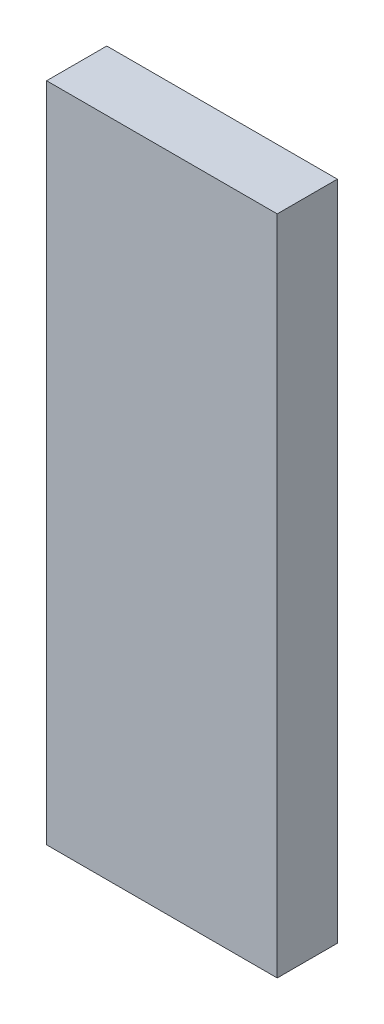
ISO-10303-21;
HEADER;
FILE_DESCRIPTION(('STEP AP214'),'2;1');
FILE_NAME('part.step','',(''),(''),'','','');
FILE_SCHEMA(('AUTOMOTIVE_DESIGN { 1 0 10303 214 1 1 1 1 }'));
ENDSEC;
DATA;
#1=APPLICATION_CONTEXT('core data for automotive mechanical design processes');
#2=APPLICATION_PROTOCOL_DEFINITION('international standard','automotive_design',2000,#1);
#3=PRODUCT_CONTEXT('',#1,'mechanical');
#4=PRODUCT('Part','Part','',(#3));
#5=PRODUCT_RELATED_PRODUCT_CATEGORY('part','',(#4));
#6=PRODUCT_DEFINITION_FORMATION('','',#4);
#7=PRODUCT_DEFINITION_CONTEXT('part definition',#1,'design');
#8=PRODUCT_DEFINITION('design','',#6,#7);
#9=PRODUCT_DEFINITION_SHAPE('','',#8);
#10=(LENGTH_UNIT() NAMED_UNIT(*) SI_UNIT(.MILLI.,.METRE.));
#11=(NAMED_UNIT(*) PLANE_ANGLE_UNIT() SI_UNIT($,.RADIAN.));
#12=(NAMED_UNIT(*) SI_UNIT($,.STERADIAN.) SOLID_ANGLE_UNIT());
#13=UNCERTAINTY_MEASURE_WITH_UNIT(LENGTH_MEASURE(1.E-05),#10,'distance_accuracy_value','');
#14=(GEOMETRIC_REPRESENTATION_CONTEXT(3) GLOBAL_UNCERTAINTY_ASSIGNED_CONTEXT((#13)) GLOBAL_UNIT_ASSIGNED_CONTEXT((#10,
#11,#12)) REPRESENTATION_CONTEXT('',''));
#15=CARTESIAN_POINT('',(0.,0.,0.));
#16=DIRECTION('',(0.,0.,1.));
#17=DIRECTION('',(1.,0.,0.));
#18=AXIS2_PLACEMENT_3D('',#15,#16,#17);
#19=CARTESIAN_POINT('',(23.,66.,6.));
#20=DIRECTION('',(-1.,0.,0.));
#21=DIRECTION('',(0.,-1.,0.));
#22=AXIS2_PLACEMENT_3D('',#19,#20,#21);
#23=PLANE('',#22);
#24=DIRECTION('',(0.,1.,0.));
#25=VECTOR('',#24,1.);
#26=CARTESIAN_POINT('',(23.,66.,-6.));
#27=LINE('',#26,#25);
#28=CARTESIAN_POINT('',(23.,-66.,-6.));
#29=VERTEX_POINT('',#28);
#30=CARTESIAN_POINT('',(23.,66.,-6.));
#31=VERTEX_POINT('',#30);
#32=EDGE_CURVE('E88',#29,#31,#27,.T.);
#33=ORIENTED_EDGE('',*,*,#32,.T.);
#34=DIRECTION('',(0.,0.,-1.));
#35=VECTOR('',#34,1.);
#36=CARTESIAN_POINT('',(23.,66.,6.));
#37=LINE('',#36,#35);
#38=CARTESIAN_POINT('',(23.,66.,6.));
#39=VERTEX_POINT('',#38);
#40=EDGE_CURVE('E11',#39,#31,#37,.T.);
#41=ORIENTED_EDGE('',*,*,#40,.F.);
#42=DIRECTION('',(0.,1.,0.));
#43=VECTOR('',#42,1.);
#44=CARTESIAN_POINT('',(23.,66.,6.));
#45=LINE('',#44,#43);
#46=CARTESIAN_POINT('',(23.,-66.,6.));
#47=VERTEX_POINT('',#46);
#48=EDGE_CURVE('E69',#47,#39,#45,.T.);
#49=ORIENTED_EDGE('',*,*,#48,.F.);
#50=DIRECTION('',(0.,0.,-1.));
#51=VECTOR('',#50,1.);
#52=CARTESIAN_POINT('',(23.,-66.,6.));
#53=LINE('',#52,#51);
#54=EDGE_CURVE('E84',#47,#29,#53,.T.);
#55=ORIENTED_EDGE('',*,*,#54,.T.);
#56=EDGE_LOOP('',(#33,#41,#49,#55));
#57=FACE_BOUND('',#56,.T.);
#58=ADVANCED_FACE('F17',(#57),#23,.F.);
#59=CARTESIAN_POINT('',(-23.,66.,6.));
#60=DIRECTION('',(0.,-1.,0.));
#61=DIRECTION('',(0.,0.,-1.));
#62=AXIS2_PLACEMENT_3D('',#59,#60,#61);
#63=PLANE('',#62);
#64=DIRECTION('',(-1.,0.,0.));
#65=VECTOR('',#64,1.);
#66=CARTESIAN_POINT('',(-23.,66.,-6.));
#67=LINE('',#66,#65);
#68=CARTESIAN_POINT('',(-23.,66.,-6.));
#69=VERTEX_POINT('',#68);
#70=EDGE_CURVE('E73',#31,#69,#67,.T.);
#71=ORIENTED_EDGE('',*,*,#70,.T.);
#72=DIRECTION('',(0.,0.,-1.));
#73=VECTOR('',#72,1.);
#74=CARTESIAN_POINT('',(-23.,66.,6.));
#75=LINE('',#74,#73);
#76=CARTESIAN_POINT('',(-23.,66.,6.));
#77=VERTEX_POINT('',#76);
#78=EDGE_CURVE('E26',#77,#69,#75,.T.);
#79=ORIENTED_EDGE('',*,*,#78,.F.);
#80=DIRECTION('',(-1.,0.,0.));
#81=VECTOR('',#80,1.);
#82=CARTESIAN_POINT('',(-23.,66.,6.));
#83=LINE('',#82,#81);
#84=EDGE_CURVE('E64',#39,#77,#83,.T.);
#85=ORIENTED_EDGE('',*,*,#84,.F.);
#86=ORIENTED_EDGE('',*,*,#40,.T.);
#87=EDGE_LOOP('',(#71,#79,#85,#86));
#88=FACE_BOUND('',#87,.T.);
#89=ADVANCED_FACE('F72',(#88),#63,.F.);
#90=CARTESIAN_POINT('',(-23.,66.,6.));
#91=DIRECTION('',(1.,0.,0.));
#92=DIRECTION('',(0.,1.,0.));
#93=AXIS2_PLACEMENT_3D('',#90,#91,#92);
#94=PLANE('',#93);
#95=DIRECTION('',(0.,-1.,0.));
#96=VECTOR('',#95,1.);
#97=CARTESIAN_POINT('',(-23.,66.,-6.));
#98=LINE('',#97,#96);
#99=CARTESIAN_POINT('',(-23.,-66.,-6.));
#100=VERTEX_POINT('',#99);
#101=EDGE_CURVE('E51',#69,#100,#98,.T.);
#102=ORIENTED_EDGE('',*,*,#101,.T.);
#103=DIRECTION('',(0.,0.,-1.));
#104=VECTOR('',#103,1.);
#105=CARTESIAN_POINT('',(-23.,-66.,6.));
#106=LINE('',#105,#104);
#107=CARTESIAN_POINT('',(-23.,-66.,6.));
#108=VERTEX_POINT('',#107);
#109=EDGE_CURVE('E75',#108,#100,#106,.T.);
#110=ORIENTED_EDGE('',*,*,#109,.F.);
#111=DIRECTION('',(0.,-1.,0.));
#112=VECTOR('',#111,1.);
#113=CARTESIAN_POINT('',(-23.,66.,6.));
#114=LINE('',#113,#112);
#115=EDGE_CURVE('E67',#77,#108,#114,.T.);
#116=ORIENTED_EDGE('',*,*,#115,.F.);
#117=ORIENTED_EDGE('',*,*,#78,.T.);
#118=EDGE_LOOP('',(#102,#110,#116,#117));
#119=FACE_BOUND('',#118,.T.);
#120=ADVANCED_FACE('F76',(#119),#94,.F.);
#121=CARTESIAN_POINT('',(-23.,-66.,6.));
#122=DIRECTION('',(0.,1.,0.));
#123=DIRECTION('',(0.,0.,1.));
#124=AXIS2_PLACEMENT_3D('',#121,#122,#123);
#125=PLANE('',#124);
#126=DIRECTION('',(1.,0.,0.));
#127=VECTOR('',#126,1.);
#128=CARTESIAN_POINT('',(-23.,-66.,-6.));
#129=LINE('',#128,#127);
#130=EDGE_CURVE('E57',#100,#29,#129,.T.);
#131=ORIENTED_EDGE('',*,*,#130,.T.);
#132=ORIENTED_EDGE('',*,*,#54,.F.);
#133=DIRECTION('',(1.,0.,0.));
#134=VECTOR('',#133,1.);
#135=CARTESIAN_POINT('',(-23.,-66.,6.));
#136=LINE('',#135,#134);
#137=EDGE_CURVE('E34',#108,#47,#136,.T.);
#138=ORIENTED_EDGE('',*,*,#137,.F.);
#139=ORIENTED_EDGE('',*,*,#109,.T.);
#140=EDGE_LOOP('',(#131,#132,#138,#139));
#141=FACE_BOUND('',#140,.T.);
#142=ADVANCED_FACE('F96',(#141),#125,.F.);
#143=CARTESIAN_POINT('',(0.,0.,6.));
#144=DIRECTION('',(0.,0.,1.));
#145=DIRECTION('',(1.,0.,0.));
#146=AXIS2_PLACEMENT_3D('',#143,#144,#145);
#147=PLANE('',#146);
#148=ORIENTED_EDGE('',*,*,#48,.T.);
#149=ORIENTED_EDGE('',*,*,#84,.T.);
#150=ORIENTED_EDGE('',*,*,#115,.T.);
#151=ORIENTED_EDGE('',*,*,#137,.T.);
#152=EDGE_LOOP('',(#148,#149,#150,#151));
#153=FACE_BOUND('',#152,.T.);
#154=ADVANCED_FACE('F65',(#153),#147,.T.);
#155=CARTESIAN_POINT('',(0.,0.,-6.));
#156=DIRECTION('',(0.,0.,1.));
#157=DIRECTION('',(1.,0.,0.));
#158=AXIS2_PLACEMENT_3D('',#155,#156,#157);
#159=PLANE('',#158);
#160=ORIENTED_EDGE('',*,*,#32,.F.);
#161=ORIENTED_EDGE('',*,*,#130,.F.);
#162=ORIENTED_EDGE('',*,*,#101,.F.);
#163=ORIENTED_EDGE('',*,*,#70,.F.);
#164=EDGE_LOOP('',(#160,#161,#162,#163));
#165=FACE_BOUND('',#164,.T.);
#166=ADVANCED_FACE('F99',(#165),#159,.F.);
#167=CLOSED_SHELL('',(#58,#89,#120,#142,#154,#166));
#168=MANIFOLD_SOLID_BREP('B1',#167);
#169=ADVANCED_BREP_SHAPE_REPRESENTATION('',(#18,#168),#14);
#170=SHAPE_DEFINITION_REPRESENTATION(#9,#169);
ENDSEC;
END-ISO-10303-21;
